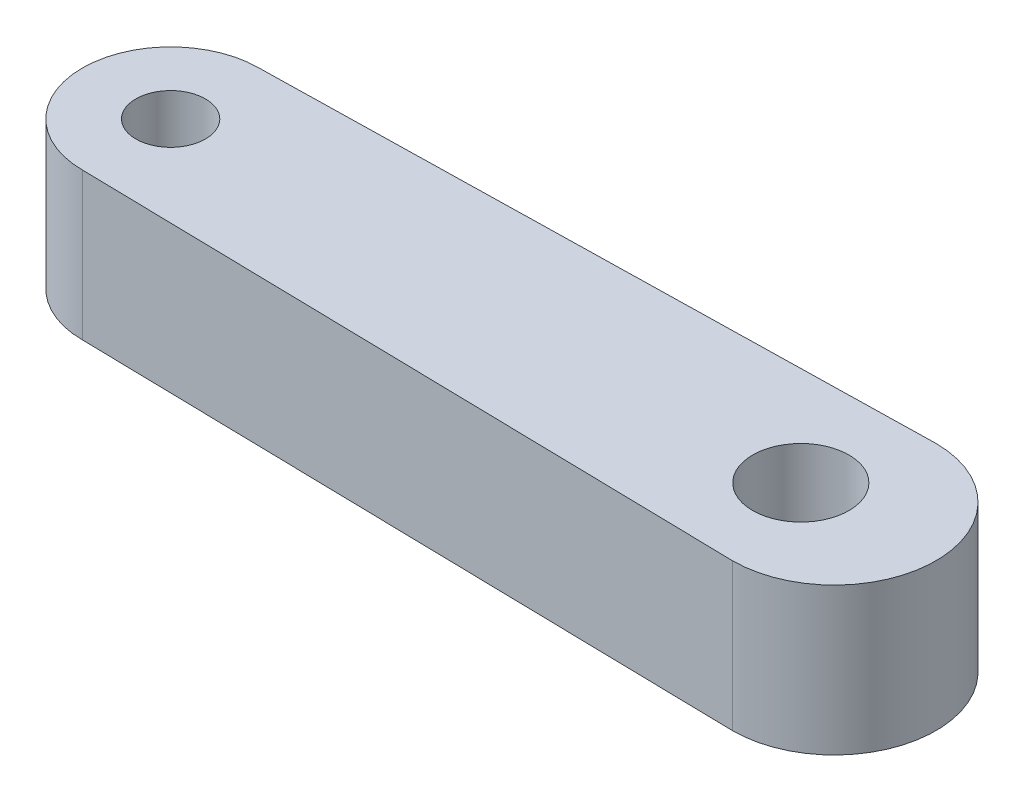
ISO-10303-21;
HEADER;
FILE_DESCRIPTION(('STEP AP214'),'2;1');
FILE_NAME('part.step','',(''),(''),'','','');
FILE_SCHEMA(('AUTOMOTIVE_DESIGN { 1 0 10303 214 1 1 1 1 }'));
ENDSEC;
DATA;
#1=APPLICATION_CONTEXT('core data for automotive mechanical design processes');
#2=APPLICATION_PROTOCOL_DEFINITION('international standard','automotive_design',2000,#1);
#3=PRODUCT_CONTEXT('',#1,'mechanical');
#4=PRODUCT('Part','Part','',(#3));
#5=PRODUCT_RELATED_PRODUCT_CATEGORY('part','',(#4));
#6=PRODUCT_DEFINITION_FORMATION('','',#4);
#7=PRODUCT_DEFINITION_CONTEXT('part definition',#1,'design');
#8=PRODUCT_DEFINITION('design','',#6,#7);
#9=PRODUCT_DEFINITION_SHAPE('','',#8);
#10=(LENGTH_UNIT() NAMED_UNIT(*) SI_UNIT(.MILLI.,.METRE.));
#11=(NAMED_UNIT(*) PLANE_ANGLE_UNIT() SI_UNIT($,.RADIAN.));
#12=(NAMED_UNIT(*) SI_UNIT($,.STERADIAN.) SOLID_ANGLE_UNIT());
#13=UNCERTAINTY_MEASURE_WITH_UNIT(LENGTH_MEASURE(1.E-05),#10,'distance_accuracy_value','');
#14=(GEOMETRIC_REPRESENTATION_CONTEXT(3) GLOBAL_UNCERTAINTY_ASSIGNED_CONTEXT((#13)) GLOBAL_UNIT_ASSIGNED_CONTEXT((#10,
#11,#12)) REPRESENTATION_CONTEXT('',''));
#15=CARTESIAN_POINT('',(0.,0.,0.));
#16=DIRECTION('',(0.,0.,1.));
#17=DIRECTION('',(1.,0.,0.));
#18=AXIS2_PLACEMENT_3D('',#15,#16,#17);
#19=CARTESIAN_POINT('',(-0.332526125891854,27.5,-16.4932958442361));
#20=DIRECTION('',(0.0201571940146029,0.,0.999796823124308));
#21=DIRECTION('',(0.999796823124308,0.,-0.0201571940146029));
#22=AXIS2_PLACEMENT_3D('',#19,#20,#21);
#23=PLANE('',#22);
#24=DIRECTION('',(-0.999796823124307,0.,0.0201571940146029));
#25=VECTOR('',#24,1.);
#26=CARTESIAN_POINT('',(-0.332526125891854,0.,-16.4932958442361));
#27=LINE('',#26,#25);
#28=CARTESIAN_POINT('',(124.,0.,-19.));
#29=VERTEX_POINT('',#28);
#30=CARTESIAN_POINT('',(0.,0.,-16.5));
#31=VERTEX_POINT('',#30);
#32=EDGE_CURVE('E119',#29,#31,#27,.T.);
#33=ORIENTED_EDGE('',*,*,#32,.T.);
#34=DIRECTION('',(0.,-1.,0.));
#35=VECTOR('',#34,1.);
#36=CARTESIAN_POINT('',(0.,27.5,-16.5));
#37=LINE('',#36,#35);
#38=CARTESIAN_POINT('',(0.,27.5,-16.5));
#39=VERTEX_POINT('',#38);
#40=EDGE_CURVE('E11',#39,#31,#37,.T.);
#41=ORIENTED_EDGE('',*,*,#40,.F.);
#42=DIRECTION('',(-0.999796823124307,0.,0.0201571940146029));
#43=VECTOR('',#42,1.);
#44=CARTESIAN_POINT('',(-0.332526125891854,27.5,-16.4932958442361));
#45=LINE('',#44,#43);
#46=CARTESIAN_POINT('',(124.,27.5,-19.));
#47=VERTEX_POINT('',#46);
#48=EDGE_CURVE('E91',#47,#39,#45,.T.);
#49=ORIENTED_EDGE('',*,*,#48,.F.);
#50=DIRECTION('',(0.,-1.,0.));
#51=VECTOR('',#50,1.);
#52=CARTESIAN_POINT('',(124.,27.5,-19.));
#53=LINE('',#52,#51);
#54=EDGE_CURVE('E107',#47,#29,#53,.T.);
#55=ORIENTED_EDGE('',*,*,#54,.T.);
#56=EDGE_LOOP('',(#33,#41,#49,#55));
#57=FACE_BOUND('',#56,.T.);
#58=ADVANCED_FACE('F42',(#57),#23,.F.);
#59=CARTESIAN_POINT('',(0.,27.5,0.));
#60=DIRECTION('',(0.,-1.,0.));
#61=DIRECTION('',(0.,0.,-1.));
#62=AXIS2_PLACEMENT_3D('',#59,#60,#61);
#63=CYLINDRICAL_SURFACE('',#62,16.4999999999998);
#64=CARTESIAN_POINT('',(0.,0.,0.));
#65=DIRECTION('',(0.,1.,0.));
#66=DIRECTION('',(0.,0.,1.));
#67=AXIS2_PLACEMENT_3D('',#64,#65,#66);
#68=CIRCLE('',#67,16.4999999999998);
#69=CARTESIAN_POINT('',(0.,0.,16.4999999999995));
#70=VERTEX_POINT('',#69);
#71=EDGE_CURVE('E97',#31,#70,#68,.T.);
#72=ORIENTED_EDGE('',*,*,#71,.T.);
#73=DIRECTION('',(0.,-1.,0.));
#74=VECTOR('',#73,1.);
#75=CARTESIAN_POINT('',(0.,27.5,16.4999999999995));
#76=LINE('',#75,#74);
#77=CARTESIAN_POINT('',(0.,27.5,16.4999999999995));
#78=VERTEX_POINT('',#77);
#79=EDGE_CURVE('E52',#78,#70,#76,.T.);
#80=ORIENTED_EDGE('',*,*,#79,.F.);
#81=CARTESIAN_POINT('',(0.,27.5,0.));
#82=DIRECTION('',(0.,1.,0.));
#83=DIRECTION('',(0.,0.,1.));
#84=AXIS2_PLACEMENT_3D('',#81,#82,#83);
#85=CIRCLE('',#84,16.4999999999998);
#86=EDGE_CURVE('E86',#39,#78,#85,.T.);
#87=ORIENTED_EDGE('',*,*,#86,.F.);
#88=ORIENTED_EDGE('',*,*,#40,.T.);
#89=EDGE_LOOP('',(#72,#80,#87,#88));
#90=FACE_BOUND('',#89,.T.);
#91=ADVANCED_FACE('F96',(#90),#63,.T.);
#92=CARTESIAN_POINT('',(-0.33252612589191,27.5,16.4932958442356));
#93=DIRECTION('',(-0.0201571940146069,0.,0.999796823124307));
#94=DIRECTION('',(0.999796823124307,0.,0.0201571940146069));
#95=AXIS2_PLACEMENT_3D('',#92,#93,#94);
#96=PLANE('',#95);
#97=DIRECTION('',(-0.999796823124308,0.,-0.0201571940146069));
#98=VECTOR('',#97,1.);
#99=CARTESIAN_POINT('',(-0.33252612589191,0.,16.4932958442356));
#100=LINE('',#99,#98);
#101=CARTESIAN_POINT('',(124.,0.,19.));
#102=VERTEX_POINT('',#101);
#103=EDGE_CURVE('E125',#102,#70,#100,.T.);
#104=ORIENTED_EDGE('',*,*,#103,.F.);
#105=DIRECTION('',(0.,-1.,0.));
#106=VECTOR('',#105,1.);
#107=CARTESIAN_POINT('',(124.,27.5,19.));
#108=LINE('',#107,#106);
#109=CARTESIAN_POINT('',(124.,27.5,19.));
#110=VERTEX_POINT('',#109);
#111=EDGE_CURVE('E76',#110,#102,#108,.T.);
#112=ORIENTED_EDGE('',*,*,#111,.F.);
#113=DIRECTION('',(-0.999796823124308,0.,-0.0201571940146069));
#114=VECTOR('',#113,1.);
#115=CARTESIAN_POINT('',(-0.33252612589191,27.5,16.4932958442356));
#116=LINE('',#115,#114);
#117=EDGE_CURVE('E89',#110,#78,#116,.T.);
#118=ORIENTED_EDGE('',*,*,#117,.T.);
#119=ORIENTED_EDGE('',*,*,#79,.T.);
#120=EDGE_LOOP('',(#104,#112,#118,#119));
#121=FACE_BOUND('',#120,.T.);
#122=ADVANCED_FACE('F102',(#121),#96,.T.);
#123=CARTESIAN_POINT('',(117.75,27.5,0.));
#124=DIRECTION('',(0.,-1.,0.));
#125=DIRECTION('',(0.,0.,-1.));
#126=AXIS2_PLACEMENT_3D('',#123,#124,#125);
#127=CYLINDRICAL_SURFACE('',#126,9.00000000000001);
#128=CARTESIAN_POINT('',(117.75,27.5,0.));
#129=DIRECTION('',(0.,1.,0.));
#130=DIRECTION('',(0.,0.,1.));
#131=AXIS2_PLACEMENT_3D('',#128,#129,#130);
#132=CIRCLE('',#131,9.00000000000001);
#133=CARTESIAN_POINT('',(117.75,27.5,9.00000000000001));
#134=VERTEX_POINT('',#133);
#135=EDGE_CURVE('E135',#134,#134,#132,.T.);
#136=ORIENTED_EDGE('',*,*,#135,.T.);
#137=EDGE_LOOP('',(#136));
#138=FACE_BOUND('',#137,.T.);
#139=CARTESIAN_POINT('',(117.75,0.,0.));
#140=DIRECTION('',(0.,1.,0.));
#141=DIRECTION('',(0.,0.,1.));
#142=AXIS2_PLACEMENT_3D('',#139,#140,#141);
#143=CIRCLE('',#142,9.00000000000001);
#144=CARTESIAN_POINT('',(117.75,0.,9.00000000000001));
#145=VERTEX_POINT('',#144);
#146=EDGE_CURVE('E115',#145,#145,#143,.T.);
#147=ORIENTED_EDGE('',*,*,#146,.F.);
#148=EDGE_LOOP('',(#147));
#149=FACE_BOUND('',#148,.T.);
#150=ADVANCED_FACE('F152',(#138,#149),#127,.F.);
#151=CARTESIAN_POINT('',(0.,27.5,0.));
#152=DIRECTION('',(0.,-1.,0.));
#153=DIRECTION('',(0.,0.,-1.));
#154=AXIS2_PLACEMENT_3D('',#151,#152,#153);
#155=CYLINDRICAL_SURFACE('',#154,6.5);
#156=CARTESIAN_POINT('',(0.,27.5,0.));
#157=DIRECTION('',(0.,1.,0.));
#158=DIRECTION('',(0.,0.,1.));
#159=AXIS2_PLACEMENT_3D('',#156,#157,#158);
#160=CIRCLE('',#159,6.5);
#161=CARTESIAN_POINT('',(0.,27.5,6.5));
#162=VERTEX_POINT('',#161);
#163=EDGE_CURVE('E130',#162,#162,#160,.T.);
#164=ORIENTED_EDGE('',*,*,#163,.T.);
#165=EDGE_LOOP('',(#164));
#166=FACE_BOUND('',#165,.T.);
#167=CARTESIAN_POINT('',(0.,0.,0.));
#168=DIRECTION('',(0.,1.,0.));
#169=DIRECTION('',(0.,0.,1.));
#170=AXIS2_PLACEMENT_3D('',#167,#168,#169);
#171=CIRCLE('',#170,6.5);
#172=CARTESIAN_POINT('',(0.,0.,6.5));
#173=VERTEX_POINT('',#172);
#174=EDGE_CURVE('E111',#173,#173,#171,.T.);
#175=ORIENTED_EDGE('',*,*,#174,.F.);
#176=EDGE_LOOP('',(#175));
#177=FACE_BOUND('',#176,.T.);
#178=ADVANCED_FACE('F44',(#166,#177),#155,.F.);
#179=CARTESIAN_POINT('',(124.,27.5,0.));
#180=DIRECTION('',(0.,-1.,0.));
#181=DIRECTION('',(0.,0.,-1.));
#182=AXIS2_PLACEMENT_3D('',#179,#180,#181);
#183=CYLINDRICAL_SURFACE('',#182,19.);
#184=CARTESIAN_POINT('',(124.,0.,0.));
#185=DIRECTION('',(0.,1.,0.));
#186=DIRECTION('',(0.,0.,1.));
#187=AXIS2_PLACEMENT_3D('',#184,#185,#186);
#188=CIRCLE('',#187,19.);
#189=EDGE_CURVE('E79',#102,#29,#188,.T.);
#190=ORIENTED_EDGE('',*,*,#189,.T.);
#191=ORIENTED_EDGE('',*,*,#54,.F.);
#192=CARTESIAN_POINT('',(124.,27.5,0.));
#193=DIRECTION('',(0.,1.,0.));
#194=DIRECTION('',(0.,0.,1.));
#195=AXIS2_PLACEMENT_3D('',#192,#193,#194);
#196=CIRCLE('',#195,19.);
#197=EDGE_CURVE('E60',#110,#47,#196,.T.);
#198=ORIENTED_EDGE('',*,*,#197,.F.);
#199=ORIENTED_EDGE('',*,*,#111,.T.);
#200=EDGE_LOOP('',(#190,#191,#198,#199));
#201=FACE_BOUND('',#200,.T.);
#202=ADVANCED_FACE('F148',(#201),#183,.T.);
#203=CARTESIAN_POINT('',(0.,27.5,0.));
#204=DIRECTION('',(0.,1.,0.));
#205=DIRECTION('',(0.,0.,1.));
#206=AXIS2_PLACEMENT_3D('',#203,#204,#205);
#207=PLANE('',#206);
#208=ORIENTED_EDGE('',*,*,#163,.F.);
#209=EDGE_LOOP('',(#208));
#210=FACE_BOUND('',#209,.T.);
#211=ORIENTED_EDGE('',*,*,#135,.F.);
#212=EDGE_LOOP('',(#211));
#213=FACE_BOUND('',#212,.T.);
#214=ORIENTED_EDGE('',*,*,#48,.T.);
#215=ORIENTED_EDGE('',*,*,#86,.T.);
#216=ORIENTED_EDGE('',*,*,#117,.F.);
#217=ORIENTED_EDGE('',*,*,#197,.T.);
#218=EDGE_LOOP('',(#214,#215,#216,#217));
#219=FACE_BOUND('',#218,.T.);
#220=ADVANCED_FACE('F87',(#210,#213,#219),#207,.T.);
#221=CARTESIAN_POINT('',(0.,0.,0.));
#222=DIRECTION('',(0.,1.,0.));
#223=DIRECTION('',(0.,0.,1.));
#224=AXIS2_PLACEMENT_3D('',#221,#222,#223);
#225=PLANE('',#224);
#226=ORIENTED_EDGE('',*,*,#174,.T.);
#227=EDGE_LOOP('',(#226));
#228=FACE_BOUND('',#227,.T.);
#229=ORIENTED_EDGE('',*,*,#146,.T.);
#230=EDGE_LOOP('',(#229));
#231=FACE_BOUND('',#230,.T.);
#232=ORIENTED_EDGE('',*,*,#32,.F.);
#233=ORIENTED_EDGE('',*,*,#189,.F.);
#234=ORIENTED_EDGE('',*,*,#103,.T.);
#235=ORIENTED_EDGE('',*,*,#71,.F.);
#236=EDGE_LOOP('',(#232,#233,#234,#235));
#237=FACE_BOUND('',#236,.T.);
#238=ADVANCED_FACE('F147',(#228,#231,#237),#225,.F.);
#239=CLOSED_SHELL('',(#58,#91,#122,#150,#178,#202,#220,#238));
#240=MANIFOLD_SOLID_BREP('B2',#239);
#241=ADVANCED_BREP_SHAPE_REPRESENTATION('',(#18,#240),#14);
#242=SHAPE_DEFINITION_REPRESENTATION(#9,#241);
ENDSEC;
END-ISO-10303-21;
